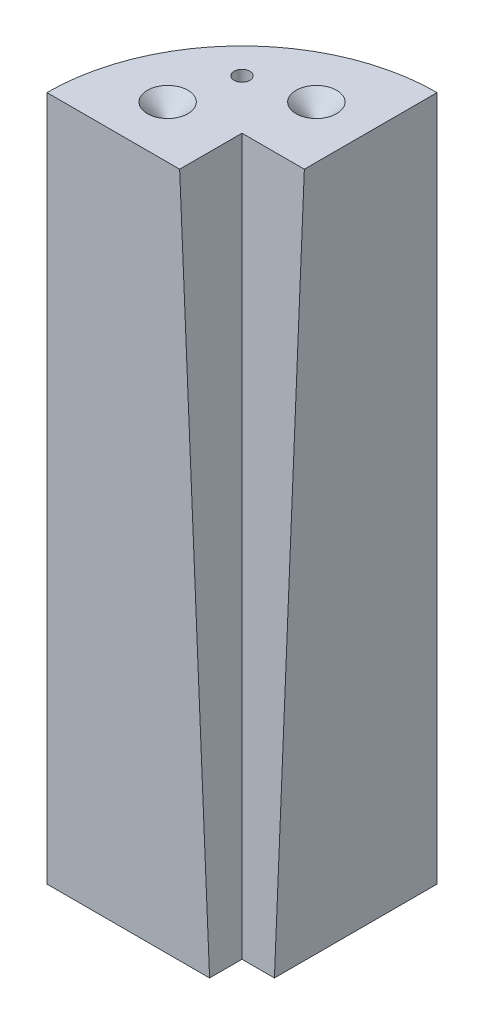
ISO-10303-21;
HEADER;
FILE_DESCRIPTION(('STEP AP214'),'2;1');
FILE_NAME('part.step','',(''),(''),'','','');
FILE_SCHEMA(('AUTOMOTIVE_DESIGN { 1 0 10303 214 1 1 1 1 }'));
ENDSEC;
DATA;
#1=APPLICATION_CONTEXT('core data for automotive mechanical design processes');
#2=APPLICATION_PROTOCOL_DEFINITION('international standard','automotive_design',2000,#1);
#3=PRODUCT_CONTEXT('',#1,'mechanical');
#4=PRODUCT('Part','Part','',(#3));
#5=PRODUCT_RELATED_PRODUCT_CATEGORY('part','',(#4));
#6=PRODUCT_DEFINITION_FORMATION('','',#4);
#7=PRODUCT_DEFINITION_CONTEXT('part definition',#1,'design');
#8=PRODUCT_DEFINITION('design','',#6,#7);
#9=PRODUCT_DEFINITION_SHAPE('','',#8);
#10=(LENGTH_UNIT() NAMED_UNIT(*) SI_UNIT(.MILLI.,.METRE.));
#11=(NAMED_UNIT(*) PLANE_ANGLE_UNIT() SI_UNIT($,.RADIAN.));
#12=(NAMED_UNIT(*) SI_UNIT($,.STERADIAN.) SOLID_ANGLE_UNIT());
#13=UNCERTAINTY_MEASURE_WITH_UNIT(LENGTH_MEASURE(1.E-05),#10,'distance_accuracy_value','');
#14=(GEOMETRIC_REPRESENTATION_CONTEXT(3) GLOBAL_UNCERTAINTY_ASSIGNED_CONTEXT((#13)) GLOBAL_UNIT_ASSIGNED_CONTEXT((#10,
#11,#12)) REPRESENTATION_CONTEXT('',''));
#15=CARTESIAN_POINT('',(0.,0.,0.));
#16=DIRECTION('',(0.,0.,1.));
#17=DIRECTION('',(1.,0.,0.));
#18=AXIS2_PLACEMENT_3D('',#15,#16,#17);
#19=CARTESIAN_POINT('',(0.,330.2,0.));
#20=DIRECTION('',(0.,-1.,0.));
#21=DIRECTION('',(0.,0.,-1.));
#22=AXIS2_PLACEMENT_3D('',#19,#20,#21);
#23=CYLINDRICAL_SURFACE('',#22,46.99);
#24=CARTESIAN_POINT('',(0.,165.1,0.));
#25=DIRECTION('',(0.,1.,0.));
#26=DIRECTION('',(0.,0.,1.));
#27=AXIS2_PLACEMENT_3D('',#24,#25,#26);
#28=CIRCLE('',#27,46.99);
#29=CARTESIAN_POINT('',(0.,165.1,-46.99));
#30=VERTEX_POINT('',#29);
#31=CARTESIAN_POINT('',(-46.99,165.1,0.));
#32=VERTEX_POINT('',#31);
#33=EDGE_CURVE('E56',#30,#32,#28,.T.);
#34=ORIENTED_EDGE('',*,*,#33,.F.);
#35=DIRECTION('',(0.,1.,0.));
#36=VECTOR('',#35,1.);
#37=CARTESIAN_POINT('',(0.,0.,-46.99));
#38=LINE('',#37,#36);
#39=CARTESIAN_POINT('',(0.,0.,-46.99));
#40=VERTEX_POINT('',#39);
#41=EDGE_CURVE('E99',#40,#30,#38,.T.);
#42=ORIENTED_EDGE('',*,*,#41,.F.);
#43=CARTESIAN_POINT('',(0.,0.,0.));
#44=DIRECTION('',(0.,1.,0.));
#45=DIRECTION('',(0.,0.,1.));
#46=AXIS2_PLACEMENT_3D('',#43,#44,#45);
#47=CIRCLE('',#46,46.99);
#48=CARTESIAN_POINT('',(-46.99,0.,0.));
#49=VERTEX_POINT('',#48);
#50=EDGE_CURVE('E117',#40,#49,#47,.T.);
#51=ORIENTED_EDGE('',*,*,#50,.T.);
#52=DIRECTION('',(0.,1.,0.));
#53=VECTOR('',#52,1.);
#54=CARTESIAN_POINT('',(-46.99,0.,0.));
#55=LINE('',#54,#53);
#56=EDGE_CURVE('E101',#49,#32,#55,.T.);
#57=ORIENTED_EDGE('',*,*,#56,.T.);
#58=EDGE_LOOP('',(#34,#42,#51,#57));
#59=FACE_BOUND('',#58,.T.);
#60=ADVANCED_FACE('F41',(#59),#23,.T.);
#61=CARTESIAN_POINT('',(-22.225,330.2,-22.225));
#62=DIRECTION('',(-0.999048221581858,-0.0436193873653361,0.));
#63=DIRECTION('',(0.0436193873653361,-0.999048221581858,0.));
#64=AXIS2_PLACEMENT_3D('',#61,#62,#63);
#65=PLANE('',#64);
#66=DIRECTION('',(0.,0.,-1.));
#67=VECTOR('',#66,1.);
#68=CARTESIAN_POINT('',(-15.0165783258046,165.1,-22.225));
#69=LINE('',#68,#67);
#70=CARTESIAN_POINT('',(-15.0165783258046,165.1,0.));
#71=VERTEX_POINT('',#70);
#72=CARTESIAN_POINT('',(-15.0165783258046,165.1,-15.0165783258046));
#73=VERTEX_POINT('',#72);
#74=EDGE_CURVE('E131',#71,#73,#69,.T.);
#75=ORIENTED_EDGE('',*,*,#74,.F.);
#76=DIRECTION('',(0.0436193873653361,-0.999048221581858,0.));
#77=VECTOR('',#76,1.);
#78=CARTESIAN_POINT('',(-22.225,330.2,0.));
#79=LINE('',#78,#77);
#80=CARTESIAN_POINT('',(-7.80815665160928,0.,0.));
#81=VERTEX_POINT('',#80);
#82=EDGE_CURVE('E11',#71,#81,#79,.T.);
#83=ORIENTED_EDGE('',*,*,#82,.T.);
#84=DIRECTION('',(0.,0.,1.));
#85=VECTOR('',#84,1.);
#86=CARTESIAN_POINT('',(-7.80815665160928,0.,0.));
#87=LINE('',#86,#85);
#88=CARTESIAN_POINT('',(-7.80815665160928,0.,-7.80815665160929));
#89=VERTEX_POINT('',#88);
#90=EDGE_CURVE('E106',#89,#81,#87,.T.);
#91=ORIENTED_EDGE('',*,*,#90,.F.);
#92=DIRECTION('',(-0.0435779502517479,0.998099155647229,-0.0435779502517479));
#93=VECTOR('',#92,1.);
#94=CARTESIAN_POINT('',(-22.225,330.2,-22.225));
#95=LINE('',#94,#93);
#96=EDGE_CURVE('E115',#89,#73,#95,.T.);
#97=ORIENTED_EDGE('',*,*,#96,.T.);
#98=EDGE_LOOP('',(#75,#83,#91,#97));
#99=FACE_BOUND('',#98,.T.);
#100=ADVANCED_FACE('F176',(#99),#65,.F.);
#101=CARTESIAN_POINT('',(-22.225,330.2,-22.225));
#102=DIRECTION('',(0.,-0.0436193873653361,-0.999048221581858));
#103=DIRECTION('',(0.,0.999048221581858,-0.0436193873653361));
#104=AXIS2_PLACEMENT_3D('',#101,#102,#103);
#105=PLANE('',#104);
#106=DIRECTION('',(1.,0.,0.));
#107=VECTOR('',#106,1.);
#108=CARTESIAN_POINT('',(-22.225,165.1,-15.0165783258046));
#109=LINE('',#108,#107);
#110=CARTESIAN_POINT('',(0.,165.1,-15.0165783258046));
#111=VERTEX_POINT('',#110);
#112=EDGE_CURVE('E89',#73,#111,#109,.T.);
#113=ORIENTED_EDGE('',*,*,#112,.F.);
#114=ORIENTED_EDGE('',*,*,#96,.F.);
#115=DIRECTION('',(-1.,0.,0.));
#116=VECTOR('',#115,1.);
#117=CARTESIAN_POINT('',(0.,0.,-7.80815665160929));
#118=LINE('',#117,#116);
#119=CARTESIAN_POINT('',(0.,0.,-7.80815665160928));
#120=VERTEX_POINT('',#119);
#121=EDGE_CURVE('E109',#120,#89,#118,.T.);
#122=ORIENTED_EDGE('',*,*,#121,.F.);
#123=DIRECTION('',(0.,0.999048221581858,-0.0436193873653361));
#124=VECTOR('',#123,1.);
#125=CARTESIAN_POINT('',(0.,330.2,-22.225));
#126=LINE('',#125,#124);
#127=EDGE_CURVE('E49',#120,#111,#126,.T.);
#128=ORIENTED_EDGE('',*,*,#127,.T.);
#129=EDGE_LOOP('',(#113,#114,#122,#128));
#130=FACE_BOUND('',#129,.T.);
#131=ADVANCED_FACE('F123',(#130),#105,.F.);
#132=CARTESIAN_POINT('',(0.,0.,-12.7));
#133=DIRECTION('',(-1.,0.,0.));
#134=DIRECTION('',(0.,0.,1.));
#135=AXIS2_PLACEMENT_3D('',#132,#133,#134);
#136=PLANE('',#135);
#137=DIRECTION('',(0.,0.,-1.));
#138=VECTOR('',#137,1.);
#139=CARTESIAN_POINT('',(0.,165.1,-46.99));
#140=LINE('',#139,#138);
#141=EDGE_CURVE('E86',#111,#30,#140,.T.);
#142=ORIENTED_EDGE('',*,*,#141,.F.);
#143=ORIENTED_EDGE('',*,*,#127,.F.);
#144=DIRECTION('',(0.,0.,1.));
#145=VECTOR('',#144,1.);
#146=CARTESIAN_POINT('',(0.,0.,-12.7));
#147=LINE('',#146,#145);
#148=EDGE_CURVE('E105',#40,#120,#147,.T.);
#149=ORIENTED_EDGE('',*,*,#148,.F.);
#150=ORIENTED_EDGE('',*,*,#41,.T.);
#151=EDGE_LOOP('',(#142,#143,#149,#150));
#152=FACE_BOUND('',#151,.T.);
#153=ADVANCED_FACE('F103',(#152),#136,.F.);
#154=CARTESIAN_POINT('',(-12.7,0.,0.));
#155=DIRECTION('',(0.,0.,-1.));
#156=DIRECTION('',(-1.,0.,0.));
#157=AXIS2_PLACEMENT_3D('',#154,#155,#156);
#158=PLANE('',#157);
#159=DIRECTION('',(1.,0.,0.));
#160=VECTOR('',#159,1.);
#161=CARTESIAN_POINT('',(0.,165.1,0.));
#162=LINE('',#161,#160);
#163=EDGE_CURVE('E93',#32,#71,#162,.T.);
#164=ORIENTED_EDGE('',*,*,#163,.F.);
#165=ORIENTED_EDGE('',*,*,#56,.F.);
#166=DIRECTION('',(-1.,0.,0.));
#167=VECTOR('',#166,1.);
#168=CARTESIAN_POINT('',(0.,0.,0.));
#169=LINE('',#168,#167);
#170=EDGE_CURVE('E128',#81,#49,#169,.T.);
#171=ORIENTED_EDGE('',*,*,#170,.F.);
#172=ORIENTED_EDGE('',*,*,#82,.F.);
#173=EDGE_LOOP('',(#164,#165,#171,#172));
#174=FACE_BOUND('',#173,.T.);
#175=ADVANCED_FACE('F163',(#174),#158,.F.);
#176=CARTESIAN_POINT('',(-26.9875,0.,-26.9875));
#177=DIRECTION('',(0.,1.,0.));
#178=DIRECTION('',(0.,0.,1.));
#179=AXIS2_PLACEMENT_3D('',#176,#177,#178);
#180=CYLINDRICAL_SURFACE('',#179,1.905);
#181=CARTESIAN_POINT('',(-26.9875,0.,-26.9875));
#182=DIRECTION('',(0.,1.,0.));
#183=DIRECTION('',(0.,0.,1.));
#184=AXIS2_PLACEMENT_3D('',#181,#182,#183);
#185=CIRCLE('',#184,1.905);
#186=CARTESIAN_POINT('',(-26.9875,0.,-25.0825));
#187=VERTEX_POINT('',#186);
#188=EDGE_CURVE('E129',#187,#187,#185,.T.);
#189=ORIENTED_EDGE('',*,*,#188,.F.);
#190=EDGE_LOOP('',(#189));
#191=FACE_BOUND('',#190,.T.);
#192=CARTESIAN_POINT('',(-26.9875,165.1,-26.9875));
#193=DIRECTION('',(0.,1.,0.));
#194=DIRECTION('',(0.,0.,1.));
#195=AXIS2_PLACEMENT_3D('',#192,#193,#194);
#196=CIRCLE('',#195,1.905);
#197=CARTESIAN_POINT('',(-26.9875,165.1,-25.0825));
#198=VERTEX_POINT('',#197);
#199=EDGE_CURVE('E44',#198,#198,#196,.F.);
#200=ORIENTED_EDGE('',*,*,#199,.F.);
#201=EDGE_LOOP('',(#200));
#202=FACE_BOUND('',#201,.T.);
#203=ADVANCED_FACE('F161',(#191,#202),#180,.F.);
#204=CARTESIAN_POINT('',(0.,0.,0.));
#205=DIRECTION('',(0.,1.,0.));
#206=DIRECTION('',(0.,0.,1.));
#207=AXIS2_PLACEMENT_3D('',#204,#205,#206);
#208=PLANE('',#207);
#209=ORIENTED_EDGE('',*,*,#188,.T.);
#210=EDGE_LOOP('',(#209));
#211=FACE_BOUND('',#210,.T.);
#212=ORIENTED_EDGE('',*,*,#50,.F.);
#213=ORIENTED_EDGE('',*,*,#148,.T.);
#214=ORIENTED_EDGE('',*,*,#121,.T.);
#215=ORIENTED_EDGE('',*,*,#90,.T.);
#216=ORIENTED_EDGE('',*,*,#170,.T.);
#217=EDGE_LOOP('',(#212,#213,#214,#215,#216));
#218=FACE_BOUND('',#217,.T.);
#219=ADVANCED_FACE('F126',(#211,#218),#208,.F.);
#220=CARTESIAN_POINT('',(0.,165.1,0.));
#221=DIRECTION('',(0.,1.,0.));
#222=DIRECTION('',(0.,0.,1.));
#223=AXIS2_PLACEMENT_3D('',#220,#221,#222);
#224=PLANE('',#223);
#225=CARTESIAN_POINT('',(-12.573,165.1,-30.48));
#226=DIRECTION('',(0.,1.,0.));
#227=DIRECTION('',(0.,0.,1.));
#228=AXIS2_PLACEMENT_3D('',#225,#226,#227);
#229=CIRCLE('',#228,4.8895);
#230=CARTESIAN_POINT('',(-12.573,165.1,-25.5905));
#231=VERTEX_POINT('',#230);
#232=EDGE_CURVE('E141',#231,#231,#229,.T.);
#233=ORIENTED_EDGE('',*,*,#232,.F.);
#234=EDGE_LOOP('',(#233));
#235=FACE_BOUND('',#234,.T.);
#236=CARTESIAN_POINT('',(-30.48,165.1,-12.573));
#237=DIRECTION('',(0.,1.,0.));
#238=DIRECTION('',(0.,0.,1.));
#239=AXIS2_PLACEMENT_3D('',#236,#237,#238);
#240=CIRCLE('',#239,4.8895);
#241=CARTESIAN_POINT('',(-30.48,165.1,-7.68350000000002));
#242=VERTEX_POINT('',#241);
#243=EDGE_CURVE('E138',#242,#242,#240,.T.);
#244=ORIENTED_EDGE('',*,*,#243,.F.);
#245=EDGE_LOOP('',(#244));
#246=FACE_BOUND('',#245,.T.);
#247=ORIENTED_EDGE('',*,*,#199,.T.);
#248=EDGE_LOOP('',(#247));
#249=FACE_BOUND('',#248,.T.);
#250=ORIENTED_EDGE('',*,*,#74,.T.);
#251=ORIENTED_EDGE('',*,*,#112,.T.);
#252=ORIENTED_EDGE('',*,*,#141,.T.);
#253=ORIENTED_EDGE('',*,*,#33,.T.);
#254=ORIENTED_EDGE('',*,*,#163,.T.);
#255=EDGE_LOOP('',(#250,#251,#252,#253,#254));
#256=FACE_BOUND('',#255,.T.);
#257=ADVANCED_FACE('F87',(#235,#246,#249,#256),#224,.T.);
#258=CARTESIAN_POINT('',(-30.48,165.1,-12.573));
#259=DIRECTION('',(0.,1.,0.));
#260=DIRECTION('',(0.,0.,1.));
#261=AXIS2_PLACEMENT_3D('',#258,#259,#260);
#262=CONICAL_SURFACE('',#261,4.8895,0.78539816339745);
#263=CARTESIAN_POINT('',(-30.48,160.3121,-12.573));
#264=DIRECTION('',(0.,1.,0.));
#265=DIRECTION('',(0.,0.,1.));
#266=AXIS2_PLACEMENT_3D('',#263,#264,#265);
#267=CIRCLE('',#266,0.101599999999969);
#268=CARTESIAN_POINT('',(-30.48,160.3121,-12.4714));
#269=VERTEX_POINT('',#268);
#270=EDGE_CURVE('E142',#269,#269,#267,.T.);
#271=CARTESIAN_POINT('',(-30.48,160.3121,-12.4714));
#272=CARTESIAN_POINT('',(-30.48,160.361973958333,-12.4215260416667));
#273=CARTESIAN_POINT('',(-30.48,160.411847916667,-12.3716520833334));
#274=CARTESIAN_POINT('',(-30.48,160.511595833333,-12.2719041666667));
#275=CARTESIAN_POINT('',(-30.48,160.561469791667,-12.2220302083334));
#276=CARTESIAN_POINT('',(-30.48,160.661217708333,-12.1222822916667));
#277=CARTESIAN_POINT('',(-30.48,160.711091666667,-12.0724083333334));
#278=CARTESIAN_POINT('',(-30.48,160.810839583333,-11.9726604166667));
#279=CARTESIAN_POINT('',(-30.48,160.860713541667,-11.9227864583334));
#280=CARTESIAN_POINT('',(-30.48,160.960461458333,-11.8230385416667));
#281=CARTESIAN_POINT('',(-30.48,161.010335416667,-11.7731645833334));
#282=CARTESIAN_POINT('',(-30.48,161.110083333333,-11.6734166666667));
#283=CARTESIAN_POINT('',(-30.48,161.159957291667,-11.6235427083334));
#284=CARTESIAN_POINT('',(-30.48,161.259705208333,-11.5237947916667));
#285=CARTESIAN_POINT('',(-30.48,161.309579166667,-11.4739208333334));
#286=CARTESIAN_POINT('',(-30.48,161.409327083333,-11.3741729166667));
#287=CARTESIAN_POINT('',(-30.48,161.459201041667,-11.3242989583334));
#288=CARTESIAN_POINT('',(-30.48,161.558948958333,-11.2245510416667));
#289=CARTESIAN_POINT('',(-30.48,161.608822916667,-11.1746770833334));
#290=CARTESIAN_POINT('',(-30.48,161.708570833333,-11.0749291666667));
#291=CARTESIAN_POINT('',(-30.48,161.758444791667,-11.0250552083334));
#292=CARTESIAN_POINT('',(-30.48,161.858192708333,-10.9253072916667));
#293=CARTESIAN_POINT('',(-30.48,161.908066666667,-10.8754333333334));
#294=CARTESIAN_POINT('',(-30.48,162.007814583333,-10.7756854166667));
#295=CARTESIAN_POINT('',(-30.48,162.057688541667,-10.7258114583334));
#296=CARTESIAN_POINT('',(-30.48,162.157436458333,-10.6260635416667));
#297=CARTESIAN_POINT('',(-30.48,162.207310416667,-10.5761895833334));
#298=CARTESIAN_POINT('',(-30.48,162.307058333333,-10.4764416666667));
#299=CARTESIAN_POINT('',(-30.48,162.356932291667,-10.4265677083334));
#300=CARTESIAN_POINT('',(-30.48,162.456680208333,-10.3268197916667));
#301=CARTESIAN_POINT('',(-30.48,162.506554166667,-10.2769458333334));
#302=CARTESIAN_POINT('',(-30.48,162.606302083333,-10.1771979166667));
#303=CARTESIAN_POINT('',(-30.48,162.656176041667,-10.1273239583334));
#304=CARTESIAN_POINT('',(-30.48,162.755923958333,-10.0275760416667));
#305=CARTESIAN_POINT('',(-30.48,162.805797916667,-9.97770208333336));
#306=CARTESIAN_POINT('',(-30.48,162.905545833333,-9.87795416666669));
#307=CARTESIAN_POINT('',(-30.48,162.955419791667,-9.82808020833336));
#308=CARTESIAN_POINT('',(-30.48,163.055167708333,-9.7283322916667));
#309=CARTESIAN_POINT('',(-30.48,163.105041666667,-9.67845833333336));
#310=CARTESIAN_POINT('',(-30.48,163.204789583333,-9.57871041666669));
#311=CARTESIAN_POINT('',(-30.48,163.254663541667,-9.52883645833336));
#312=CARTESIAN_POINT('',(-30.48,163.354411458333,-9.42908854166669));
#313=CARTESIAN_POINT('',(-30.48,163.404285416667,-9.37921458333336));
#314=CARTESIAN_POINT('',(-30.48,163.504033333333,-9.27946666666669));
#315=CARTESIAN_POINT('',(-30.48,163.553907291667,-9.22959270833335));
#316=CARTESIAN_POINT('',(-30.48,163.653655208333,-9.12984479166669));
#317=CARTESIAN_POINT('',(-30.48,163.703529166667,-9.07997083333336));
#318=CARTESIAN_POINT('',(-30.48,163.803277083333,-8.98022291666669));
#319=CARTESIAN_POINT('',(-30.48,163.853151041667,-8.93034895833336));
#320=CARTESIAN_POINT('',(-30.48,163.952898958333,-8.83060104166669));
#321=CARTESIAN_POINT('',(-30.48,164.002772916667,-8.78072708333336));
#322=CARTESIAN_POINT('',(-30.48,164.102520833333,-8.68097916666669));
#323=CARTESIAN_POINT('',(-30.48,164.152394791667,-8.63110520833336));
#324=CARTESIAN_POINT('',(-30.48,164.252142708333,-8.53135729166669));
#325=CARTESIAN_POINT('',(-30.48,164.302016666667,-8.48148333333335));
#326=CARTESIAN_POINT('',(-30.48,164.401764583333,-8.38173541666668));
#327=CARTESIAN_POINT('',(-30.48,164.451638541667,-8.33186145833335));
#328=CARTESIAN_POINT('',(-30.48,164.551386458333,-8.23211354166669));
#329=CARTESIAN_POINT('',(-30.48,164.601260416667,-8.18223958333335));
#330=CARTESIAN_POINT('',(-30.48,164.701008333333,-8.08249166666669));
#331=CARTESIAN_POINT('',(-30.48,164.750882291667,-8.03261770833335));
#332=CARTESIAN_POINT('',(-30.48,164.850630208333,-7.93286979166668));
#333=CARTESIAN_POINT('',(-30.48,164.900504166667,-7.88299583333335));
#334=CARTESIAN_POINT('',(-30.48,165.000252083333,-7.78324791666669));
#335=CARTESIAN_POINT('',(-30.48,165.050126041667,-7.73337395833335));
#336=CARTESIAN_POINT('',(-30.48,165.1,-7.68350000000002));
#337=B_SPLINE_CURVE_WITH_KNOTS('',3,(#271,#272,#273,#274,#275,#276,#277,#278,#279,#280,#281,
#282,#283,#284,#285,#286,#287,#288,#289,#290,#291,#292,#293,#294,#295,#296,#297,#298,#299,#300,
#301,#302,#303,#304,#305,#306,#307,#308,#309,#310,#311,#312,#313,#314,#315,#316,#317,#318,#319,
#320,#321,#322,#323,#324,#325,#326,#327,#328,#329,#330,#331,#332,#333,#334,#335,#336),
.UNSPECIFIED.,.F.,.F.,(4,2,2,2,2,2,2,2,2,2,2,2,2,2,2,2,2,2,2,2,2,2,2,2,2,2,2,2,2,2,2,2,4),(0.,
0.211597284852697,0.423194569705395,0.63479185455809,0.846389139410787,1.05798642426348,
1.26958370911616,1.48118099396886,1.69277827882155,1.90437556367425,2.11597284852695,
2.32757013337962,2.53916741823232,2.75076470308502,2.96236198793771,3.17395927279041,
3.38555655764311,3.59715384249578,3.80875112734848,4.02034841220118,4.23194569705387,
4.44354298190657,4.65514026675925,4.86673755161194,5.07833483646464,5.28993212131734,
5.50152940617003,5.71312669102271,5.9247239758754,6.1363212607281,6.3479185455808,
6.55951583043349,6.77111311528617),.UNSPECIFIED.);
#338=EDGE_CURVE('BSEAM154',#269,#242,#337,.T.);
#339=ORIENTED_EDGE('',*,*,#270,.F.);
#340=ORIENTED_EDGE('',*,*,#243,.T.);
#341=ORIENTED_EDGE('',*,*,#338,.T.);
#342=ORIENTED_EDGE('',*,*,#338,.F.);
#343=EDGE_LOOP('',(#339,#341,#340,#342));
#344=FACE_BOUND('',#343,.T.);
#345=ADVANCED_FACE('F154',(#344),#262,.F.);
#346=CARTESIAN_POINT('',(-30.48,160.3121,-12.573));
#347=DIRECTION('',(0.,1.,0.));
#348=DIRECTION('',(0.,0.,1.));
#349=AXIS2_PLACEMENT_3D('',#346,#347,#348);
#350=PLANE('',#349);
#351=ORIENTED_EDGE('',*,*,#270,.T.);
#352=EDGE_LOOP('',(#351));
#353=FACE_BOUND('',#352,.T.);
#354=ADVANCED_FACE('F240',(#353),#350,.T.);
#355=CARTESIAN_POINT('',(-12.573,165.1,-30.48));
#356=DIRECTION('',(0.,1.,0.));
#357=DIRECTION('',(0.,0.,1.));
#358=AXIS2_PLACEMENT_3D('',#355,#356,#357);
#359=CONICAL_SURFACE('',#358,4.8895,0.78539816339745);
#360=CARTESIAN_POINT('',(-12.573,160.3121,-30.48));
#361=DIRECTION('',(0.,1.,0.));
#362=DIRECTION('',(0.,0.,1.));
#363=AXIS2_PLACEMENT_3D('',#360,#361,#362);
#364=CIRCLE('',#363,0.101599999999975);
#365=CARTESIAN_POINT('',(-12.573,160.3121,-30.3784));
#366=VERTEX_POINT('',#365);
#367=EDGE_CURVE('E137',#366,#366,#364,.T.);
#368=CARTESIAN_POINT('',(-12.573,160.3121,-30.3784));
#369=CARTESIAN_POINT('',(-12.573,160.361973958333,-30.3285260416667));
#370=CARTESIAN_POINT('',(-12.573,160.411847916667,-30.2786520833334));
#371=CARTESIAN_POINT('',(-12.573,160.511595833333,-30.1789041666667));
#372=CARTESIAN_POINT('',(-12.573,160.561469791667,-30.1290302083334));
#373=CARTESIAN_POINT('',(-12.573,160.661217708333,-30.0292822916667));
#374=CARTESIAN_POINT('',(-12.573,160.711091666667,-29.9794083333334));
#375=CARTESIAN_POINT('',(-12.573,160.810839583333,-29.8796604166667));
#376=CARTESIAN_POINT('',(-12.573,160.860713541667,-29.8297864583334));
#377=CARTESIAN_POINT('',(-12.573,160.960461458333,-29.7300385416667));
#378=CARTESIAN_POINT('',(-12.573,161.010335416667,-29.6801645833334));
#379=CARTESIAN_POINT('',(-12.573,161.110083333333,-29.5804166666667));
#380=CARTESIAN_POINT('',(-12.573,161.159957291667,-29.5305427083334));
#381=CARTESIAN_POINT('',(-12.573,161.259705208333,-29.4307947916667));
#382=CARTESIAN_POINT('',(-12.573,161.309579166667,-29.3809208333334));
#383=CARTESIAN_POINT('',(-12.573,161.409327083333,-29.2811729166667));
#384=CARTESIAN_POINT('',(-12.573,161.459201041667,-29.2312989583334));
#385=CARTESIAN_POINT('',(-12.573,161.558948958333,-29.1315510416667));
#386=CARTESIAN_POINT('',(-12.573,161.608822916667,-29.0816770833334));
#387=CARTESIAN_POINT('',(-12.573,161.708570833333,-28.9819291666667));
#388=CARTESIAN_POINT('',(-12.573,161.758444791667,-28.9320552083334));
#389=CARTESIAN_POINT('',(-12.573,161.858192708333,-28.8323072916667));
#390=CARTESIAN_POINT('',(-12.573,161.908066666667,-28.7824333333334));
#391=CARTESIAN_POINT('',(-12.573,162.007814583333,-28.6826854166667));
#392=CARTESIAN_POINT('',(-12.573,162.057688541667,-28.6328114583334));
#393=CARTESIAN_POINT('',(-12.573,162.157436458333,-28.5330635416667));
#394=CARTESIAN_POINT('',(-12.573,162.207310416667,-28.4831895833334));
#395=CARTESIAN_POINT('',(-12.573,162.307058333333,-28.3834416666667));
#396=CARTESIAN_POINT('',(-12.573,162.356932291667,-28.3335677083334));
#397=CARTESIAN_POINT('',(-12.573,162.456680208333,-28.2338197916667));
#398=CARTESIAN_POINT('',(-12.573,162.506554166667,-28.1839458333334));
#399=CARTESIAN_POINT('',(-12.573,162.606302083333,-28.0841979166667));
#400=CARTESIAN_POINT('',(-12.573,162.656176041667,-28.0343239583334));
#401=CARTESIAN_POINT('',(-12.573,162.755923958333,-27.9345760416667));
#402=CARTESIAN_POINT('',(-12.573,162.805797916667,-27.8847020833334));
#403=CARTESIAN_POINT('',(-12.573,162.905545833333,-27.7849541666667));
#404=CARTESIAN_POINT('',(-12.573,162.955419791667,-27.7350802083334));
#405=CARTESIAN_POINT('',(-12.573,163.055167708333,-27.6353322916667));
#406=CARTESIAN_POINT('',(-12.573,163.105041666667,-27.5854583333334));
#407=CARTESIAN_POINT('',(-12.573,163.204789583333,-27.4857104166667));
#408=CARTESIAN_POINT('',(-12.573,163.254663541667,-27.4358364583333));
#409=CARTESIAN_POINT('',(-12.573,163.354411458333,-27.3360885416667));
#410=CARTESIAN_POINT('',(-12.573,163.404285416667,-27.2862145833334));
#411=CARTESIAN_POINT('',(-12.573,163.504033333333,-27.1864666666667));
#412=CARTESIAN_POINT('',(-12.573,163.553907291667,-27.1365927083333));
#413=CARTESIAN_POINT('',(-12.573,163.653655208333,-27.0368447916667));
#414=CARTESIAN_POINT('',(-12.573,163.703529166667,-26.9869708333333));
#415=CARTESIAN_POINT('',(-12.573,163.803277083333,-26.8872229166667));
#416=CARTESIAN_POINT('',(-12.573,163.853151041667,-26.8373489583334));
#417=CARTESIAN_POINT('',(-12.573,163.952898958333,-26.7376010416667));
#418=CARTESIAN_POINT('',(-12.573,164.002772916667,-26.6877270833333));
#419=CARTESIAN_POINT('',(-12.573,164.102520833333,-26.5879791666667));
#420=CARTESIAN_POINT('',(-12.573,164.152394791667,-26.5381052083333));
#421=CARTESIAN_POINT('',(-12.573,164.252142708333,-26.4383572916667));
#422=CARTESIAN_POINT('',(-12.573,164.302016666667,-26.3884833333333));
#423=CARTESIAN_POINT('',(-12.573,164.401764583333,-26.2887354166667));
#424=CARTESIAN_POINT('',(-12.573,164.451638541667,-26.2388614583333));
#425=CARTESIAN_POINT('',(-12.573,164.551386458333,-26.1391135416667));
#426=CARTESIAN_POINT('',(-12.573,164.601260416667,-26.0892395833333));
#427=CARTESIAN_POINT('',(-12.573,164.701008333333,-25.9894916666667));
#428=CARTESIAN_POINT('',(-12.573,164.750882291667,-25.9396177083333));
#429=CARTESIAN_POINT('',(-12.573,164.850630208333,-25.8398697916667));
#430=CARTESIAN_POINT('',(-12.573,164.900504166667,-25.7899958333333));
#431=CARTESIAN_POINT('',(-12.573,165.000252083333,-25.6902479166667));
#432=CARTESIAN_POINT('',(-12.573,165.050126041667,-25.6403739583333));
#433=CARTESIAN_POINT('',(-12.573,165.1,-25.5905));
#434=B_SPLINE_CURVE_WITH_KNOTS('',3,(#368,#369,#370,#371,#372,#373,#374,#375,#376,#377,#378,
#379,#380,#381,#382,#383,#384,#385,#386,#387,#388,#389,#390,#391,#392,#393,#394,#395,#396,#397,
#398,#399,#400,#401,#402,#403,#404,#405,#406,#407,#408,#409,#410,#411,#412,#413,#414,#415,#416,
#417,#418,#419,#420,#421,#422,#423,#424,#425,#426,#427,#428,#429,#430,#431,#432,#433),
.UNSPECIFIED.,.F.,.F.,(4,2,2,2,2,2,2,2,2,2,2,2,2,2,2,2,2,2,2,2,2,2,2,2,2,2,2,2,2,2,2,2,4),(0.,
0.211597284852695,0.423194569705392,0.63479185455809,0.846389139410785,1.05798642426348,
1.26958370911616,1.48118099396885,1.69277827882155,1.90437556367425,2.11597284852694,
2.32757013337962,2.53916741823232,2.75076470308501,2.96236198793771,3.17395927279041,
3.3855565576431,3.59715384249578,3.80875112734848,4.02034841220117,4.23194569705387,
4.44354298190657,4.65514026675924,4.86673755161194,5.07833483646464,5.28993212131733,
5.50152940617003,5.71312669102271,5.9247239758754,6.1363212607281,6.3479185455808,
6.55951583043349,6.77111311528617),.UNSPECIFIED.);
#435=EDGE_CURVE('BSEAM150',#366,#231,#434,.T.);
#436=ORIENTED_EDGE('',*,*,#367,.F.);
#437=ORIENTED_EDGE('',*,*,#232,.T.);
#438=ORIENTED_EDGE('',*,*,#435,.T.);
#439=ORIENTED_EDGE('',*,*,#435,.F.);
#440=EDGE_LOOP('',(#436,#438,#437,#439));
#441=FACE_BOUND('',#440,.T.);
#442=ADVANCED_FACE('F150',(#441),#359,.F.);
#443=CARTESIAN_POINT('',(-12.573,160.3121,-30.48));
#444=DIRECTION('',(0.,1.,0.));
#445=DIRECTION('',(0.,0.,1.));
#446=AXIS2_PLACEMENT_3D('',#443,#444,#445);
#447=PLANE('',#446);
#448=ORIENTED_EDGE('',*,*,#367,.T.);
#449=EDGE_LOOP('',(#448));
#450=FACE_BOUND('',#449,.T.);
#451=ADVANCED_FACE('F259',(#450),#447,.T.);
#452=CLOSED_SHELL('',(#60,#100,#131,#153,#175,#203,#219,#257,#345,#354,#442,#451));
#453=MANIFOLD_SOLID_BREP('B2',#452);
#454=ADVANCED_BREP_SHAPE_REPRESENTATION('',(#18,#453),#14);
#455=SHAPE_DEFINITION_REPRESENTATION(#9,#454);
ENDSEC;
END-ISO-10303-21;
